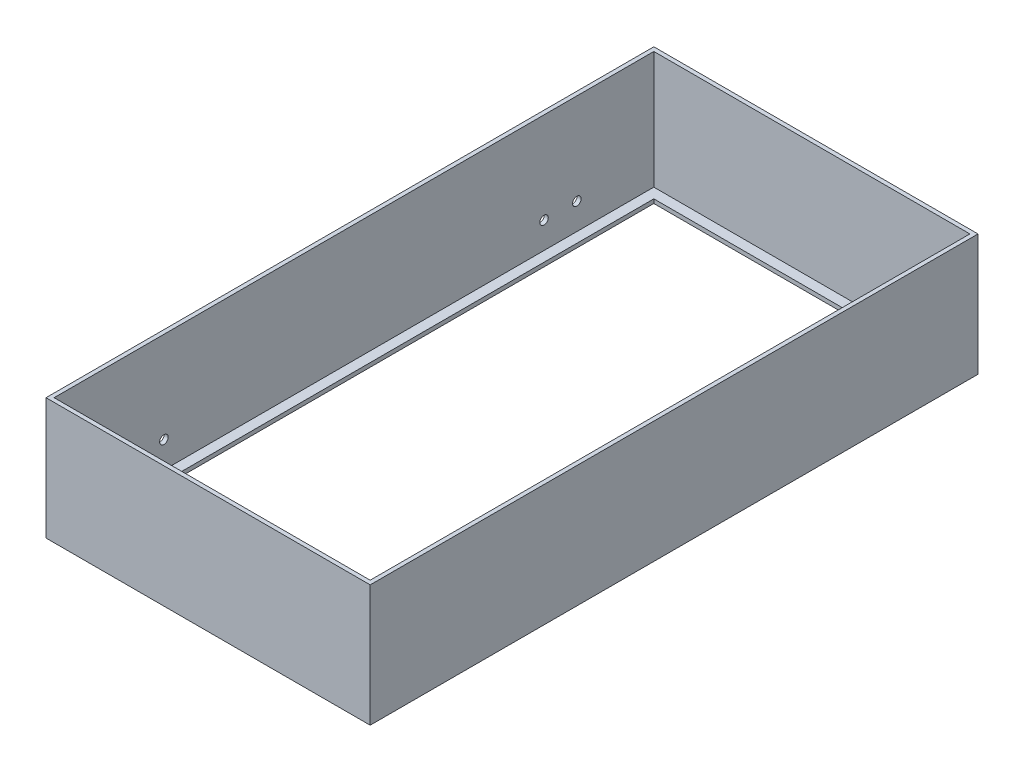
ISO-10303-21;
HEADER;
FILE_DESCRIPTION(('STEP AP214'),'2;1');
FILE_NAME('part.step','',(''),(''),'','','');
FILE_SCHEMA(('AUTOMOTIVE_DESIGN { 1 0 10303 214 1 1 1 1 }'));
ENDSEC;
DATA;
#1=APPLICATION_CONTEXT('core data for automotive mechanical design processes');
#2=APPLICATION_PROTOCOL_DEFINITION('international standard','automotive_design',2000,#1);
#3=PRODUCT_CONTEXT('',#1,'mechanical');
#4=PRODUCT('Part','Part','',(#3));
#5=PRODUCT_RELATED_PRODUCT_CATEGORY('part','',(#4));
#6=PRODUCT_DEFINITION_FORMATION('','',#4);
#7=PRODUCT_DEFINITION_CONTEXT('part definition',#1,'design');
#8=PRODUCT_DEFINITION('design','',#6,#7);
#9=PRODUCT_DEFINITION_SHAPE('','',#8);
#10=(LENGTH_UNIT() NAMED_UNIT(*) SI_UNIT(.MILLI.,.METRE.));
#11=(NAMED_UNIT(*) PLANE_ANGLE_UNIT() SI_UNIT($,.RADIAN.));
#12=(NAMED_UNIT(*) SI_UNIT($,.STERADIAN.) SOLID_ANGLE_UNIT());
#13=UNCERTAINTY_MEASURE_WITH_UNIT(LENGTH_MEASURE(1.E-05),#10,'distance_accuracy_value','');
#14=(GEOMETRIC_REPRESENTATION_CONTEXT(3) GLOBAL_UNCERTAINTY_ASSIGNED_CONTEXT((#13)) GLOBAL_UNIT_ASSIGNED_CONTEXT((#10,
#11,#12)) REPRESENTATION_CONTEXT('',''));
#15=CARTESIAN_POINT('',(0.,0.,0.));
#16=DIRECTION('',(0.,0.,1.));
#17=DIRECTION('',(1.,0.,0.));
#18=AXIS2_PLACEMENT_3D('',#15,#16,#17);
#19=CARTESIAN_POINT('',(203.2,76.2,381.));
#20=DIRECTION('',(0.,-1.,0.));
#21=DIRECTION('',(1.,0.,0.));
#22=AXIS2_PLACEMENT_3D('',#19,#20,#21);
#23=PLANE('',#22);
#24=DIRECTION('',(-1.,0.,0.));
#25=VECTOR('',#24,1.);
#26=CARTESIAN_POINT('',(200.66,76.2,2.54));
#27=LINE('',#26,#25);
#28=CARTESIAN_POINT('',(200.66,76.2,2.53999999999999));
#29=VERTEX_POINT('',#28);
#30=CARTESIAN_POINT('',(2.54,76.2,2.54));
#31=VERTEX_POINT('',#30);
#32=EDGE_CURVE('E180',#29,#31,#27,.T.);
#33=ORIENTED_EDGE('',*,*,#32,.F.);
#34=DIRECTION('',(0.,0.,-1.));
#35=VECTOR('',#34,1.);
#36=CARTESIAN_POINT('',(200.66,76.2,378.46));
#37=LINE('',#36,#35);
#38=CARTESIAN_POINT('',(200.66,76.2,378.46));
#39=VERTEX_POINT('',#38);
#40=EDGE_CURVE('E178',#39,#29,#37,.T.);
#41=ORIENTED_EDGE('',*,*,#40,.F.);
#42=DIRECTION('',(1.,0.,0.));
#43=VECTOR('',#42,1.);
#44=CARTESIAN_POINT('',(2.54,76.2,378.46));
#45=LINE('',#44,#43);
#46=CARTESIAN_POINT('',(2.54,76.2,378.46));
#47=VERTEX_POINT('',#46);
#48=EDGE_CURVE('E185',#47,#39,#45,.T.);
#49=ORIENTED_EDGE('',*,*,#48,.F.);
#50=DIRECTION('',(0.,0.,1.));
#51=VECTOR('',#50,1.);
#52=CARTESIAN_POINT('',(2.54,76.2,2.54));
#53=LINE('',#52,#51);
#54=EDGE_CURVE('E182',#31,#47,#53,.T.);
#55=ORIENTED_EDGE('',*,*,#54,.F.);
#56=EDGE_LOOP('',(#33,#41,#49,#55));
#57=FACE_BOUND('',#56,.T.);
#58=DIRECTION('',(-1.,0.,0.));
#59=VECTOR('',#58,1.);
#60=CARTESIAN_POINT('',(203.2,76.2,0.));
#61=LINE('',#60,#59);
#62=CARTESIAN_POINT('',(203.2,76.2,0.));
#63=VERTEX_POINT('',#62);
#64=CARTESIAN_POINT('',(0.,76.2,0.));
#65=VERTEX_POINT('',#64);
#66=EDGE_CURVE('E190',#63,#65,#61,.T.);
#67=ORIENTED_EDGE('',*,*,#66,.T.);
#68=DIRECTION('',(0.,0.,-1.));
#69=VECTOR('',#68,1.);
#70=CARTESIAN_POINT('',(0.,76.2,381.));
#71=LINE('',#70,#69);
#72=CARTESIAN_POINT('',(0.,76.2,381.));
#73=VERTEX_POINT('',#72);
#74=EDGE_CURVE('E11',#73,#65,#71,.T.);
#75=ORIENTED_EDGE('',*,*,#74,.F.);
#76=DIRECTION('',(-1.,0.,0.));
#77=VECTOR('',#76,1.);
#78=CARTESIAN_POINT('',(203.2,76.2,381.));
#79=LINE('',#78,#77);
#80=CARTESIAN_POINT('',(203.2,76.2,381.));
#81=VERTEX_POINT('',#80);
#82=EDGE_CURVE('E196',#81,#73,#79,.T.);
#83=ORIENTED_EDGE('',*,*,#82,.F.);
#84=DIRECTION('',(0.,0.,-1.));
#85=VECTOR('',#84,1.);
#86=CARTESIAN_POINT('',(203.2,76.2,381.));
#87=LINE('',#86,#85);
#88=EDGE_CURVE('E206',#81,#63,#87,.T.);
#89=ORIENTED_EDGE('',*,*,#88,.T.);
#90=EDGE_LOOP('',(#67,#75,#83,#89));
#91=FACE_BOUND('',#90,.T.);
#92=ADVANCED_FACE('F38',(#57,#91),#23,.F.);
#93=CARTESIAN_POINT('',(0.,76.2,381.));
#94=DIRECTION('',(1.,0.,0.));
#95=DIRECTION('',(0.,1.,0.));
#96=AXIS2_PLACEMENT_3D('',#93,#94,#95);
#97=PLANE('',#96);
#98=CARTESIAN_POINT('',(0.,19.05,71.374));
#99=DIRECTION('',(1.,0.,0.));
#100=DIRECTION('',(0.,-1.,0.));
#101=AXIS2_PLACEMENT_3D('',#98,#99,#100);
#102=CIRCLE('',#101,2.66699999999997);
#103=CARTESIAN_POINT('',(0.,16.383,71.374));
#104=VERTEX_POINT('',#103);
#105=EDGE_CURVE('E309',#104,#104,#102,.T.);
#106=ORIENTED_EDGE('',*,*,#105,.T.);
#107=EDGE_LOOP('',(#106));
#108=FACE_BOUND('',#107,.T.);
#109=CARTESIAN_POINT('',(0.,19.05,50.8));
#110=DIRECTION('',(1.,0.,0.));
#111=DIRECTION('',(0.,-1.,0.));
#112=AXIS2_PLACEMENT_3D('',#109,#110,#111);
#113=CIRCLE('',#112,2.66699999999997);
#114=CARTESIAN_POINT('',(0.,16.383,50.8));
#115=VERTEX_POINT('',#114);
#116=EDGE_CURVE('E315',#115,#115,#113,.T.);
#117=ORIENTED_EDGE('',*,*,#116,.T.);
#118=EDGE_LOOP('',(#117));
#119=FACE_BOUND('',#118,.T.);
#120=CARTESIAN_POINT('',(0.,19.05,309.626));
#121=DIRECTION('',(-1.,0.,0.));
#122=DIRECTION('',(0.,-1.,0.));
#123=AXIS2_PLACEMENT_3D('',#120,#121,#122);
#124=CIRCLE('',#123,2.66699999999997);
#125=CARTESIAN_POINT('',(0.,16.383,309.626));
#126=VERTEX_POINT('',#125);
#127=EDGE_CURVE('E322',#126,#126,#124,.T.);
#128=ORIENTED_EDGE('',*,*,#127,.F.);
#129=EDGE_LOOP('',(#128));
#130=FACE_BOUND('',#129,.T.);
#131=CARTESIAN_POINT('',(0.,19.05,330.2));
#132=DIRECTION('',(-1.,0.,0.));
#133=DIRECTION('',(0.,-1.,0.));
#134=AXIS2_PLACEMENT_3D('',#131,#132,#133);
#135=CIRCLE('',#134,2.66699999999997);
#136=CARTESIAN_POINT('',(0.,16.383,330.2));
#137=VERTEX_POINT('',#136);
#138=EDGE_CURVE('E312',#137,#137,#135,.T.);
#139=ORIENTED_EDGE('',*,*,#138,.F.);
#140=EDGE_LOOP('',(#139));
#141=FACE_BOUND('',#140,.T.);
#142=DIRECTION('',(0.,-1.,0.));
#143=VECTOR('',#142,1.);
#144=CARTESIAN_POINT('',(0.,76.2,0.));
#145=LINE('',#144,#143);
#146=CARTESIAN_POINT('',(0.,0.,0.));
#147=VERTEX_POINT('',#146);
#148=EDGE_CURVE('E209',#65,#147,#145,.T.);
#149=ORIENTED_EDGE('',*,*,#148,.T.);
#150=DIRECTION('',(0.,0.,-1.));
#151=VECTOR('',#150,1.);
#152=CARTESIAN_POINT('',(0.,0.,381.));
#153=LINE('',#152,#151);
#154=CARTESIAN_POINT('',(0.,0.,381.));
#155=VERTEX_POINT('',#154);
#156=EDGE_CURVE('E45',#155,#147,#153,.T.);
#157=ORIENTED_EDGE('',*,*,#156,.F.);
#158=DIRECTION('',(0.,-1.,0.));
#159=VECTOR('',#158,1.);
#160=CARTESIAN_POINT('',(0.,76.2,381.));
#161=LINE('',#160,#159);
#162=EDGE_CURVE('E199',#73,#155,#161,.T.);
#163=ORIENTED_EDGE('',*,*,#162,.F.);
#164=ORIENTED_EDGE('',*,*,#74,.T.);
#165=EDGE_LOOP('',(#149,#157,#163,#164));
#166=FACE_BOUND('',#165,.T.);
#167=ADVANCED_FACE('F240',(#108,#119,#130,#141,#166),#97,.F.);
#168=CARTESIAN_POINT('',(203.2,0.,381.));
#169=DIRECTION('',(0.,1.,0.));
#170=DIRECTION('',(0.,0.,1.));
#171=AXIS2_PLACEMENT_3D('',#168,#169,#170);
#172=PLANE('',#171);
#173=DIRECTION('',(1.,0.,0.));
#174=VECTOR('',#173,1.);
#175=CARTESIAN_POINT('',(203.2,0.,0.));
#176=LINE('',#175,#174);
#177=CARTESIAN_POINT('',(203.2,0.,0.));
#178=VERTEX_POINT('',#177);
#179=EDGE_CURVE('E211',#147,#178,#176,.T.);
#180=ORIENTED_EDGE('',*,*,#179,.T.);
#181=DIRECTION('',(0.,0.,-1.));
#182=VECTOR('',#181,1.);
#183=CARTESIAN_POINT('',(203.2,0.,381.));
#184=LINE('',#183,#182);
#185=CARTESIAN_POINT('',(203.2,0.,381.));
#186=VERTEX_POINT('',#185);
#187=EDGE_CURVE('E216',#186,#178,#184,.T.);
#188=ORIENTED_EDGE('',*,*,#187,.F.);
#189=DIRECTION('',(1.,0.,0.));
#190=VECTOR('',#189,1.);
#191=CARTESIAN_POINT('',(203.2,0.,381.));
#192=LINE('',#191,#190);
#193=EDGE_CURVE('E202',#155,#186,#192,.T.);
#194=ORIENTED_EDGE('',*,*,#193,.F.);
#195=ORIENTED_EDGE('',*,*,#156,.T.);
#196=EDGE_LOOP('',(#180,#188,#194,#195));
#197=FACE_BOUND('',#196,.T.);
#198=DIRECTION('',(0.,0.,1.));
#199=VECTOR('',#198,1.);
#200=CARTESIAN_POINT('',(8.89,0.,8.89));
#201=LINE('',#200,#199);
#202=CARTESIAN_POINT('',(8.89,0.,8.89));
#203=VERTEX_POINT('',#202);
#204=CARTESIAN_POINT('',(8.89,0.,372.11));
#205=VERTEX_POINT('',#204);
#206=EDGE_CURVE('E159',#203,#205,#201,.T.);
#207=ORIENTED_EDGE('',*,*,#206,.T.);
#208=DIRECTION('',(1.,0.,0.));
#209=VECTOR('',#208,1.);
#210=CARTESIAN_POINT('',(8.89,0.,372.11));
#211=LINE('',#210,#209);
#212=CARTESIAN_POINT('',(194.31,0.,372.11));
#213=VERTEX_POINT('',#212);
#214=EDGE_CURVE('E145',#205,#213,#211,.T.);
#215=ORIENTED_EDGE('',*,*,#214,.T.);
#216=DIRECTION('',(0.,0.,-1.));
#217=VECTOR('',#216,1.);
#218=CARTESIAN_POINT('',(194.31,0.,372.11));
#219=LINE('',#218,#217);
#220=CARTESIAN_POINT('',(194.31,0.,8.88999999999999));
#221=VERTEX_POINT('',#220);
#222=EDGE_CURVE('E163',#213,#221,#219,.T.);
#223=ORIENTED_EDGE('',*,*,#222,.T.);
#224=DIRECTION('',(-1.,0.,0.));
#225=VECTOR('',#224,1.);
#226=CARTESIAN_POINT('',(194.31,0.,8.88999999999999));
#227=LINE('',#226,#225);
#228=EDGE_CURVE('E139',#221,#203,#227,.T.);
#229=ORIENTED_EDGE('',*,*,#228,.T.);
#230=EDGE_LOOP('',(#207,#215,#223,#229));
#231=FACE_BOUND('',#230,.T.);
#232=ADVANCED_FACE('F223',(#197,#231),#172,.F.);
#233=CARTESIAN_POINT('',(203.2,0.,381.));
#234=DIRECTION('',(-1.,0.,0.));
#235=DIRECTION('',(0.,0.,1.));
#236=AXIS2_PLACEMENT_3D('',#233,#234,#235);
#237=PLANE('',#236);
#238=DIRECTION('',(0.,1.,0.));
#239=VECTOR('',#238,1.);
#240=CARTESIAN_POINT('',(203.2,0.,0.));
#241=LINE('',#240,#239);
#242=EDGE_CURVE('E200',#178,#63,#241,.T.);
#243=ORIENTED_EDGE('',*,*,#242,.T.);
#244=ORIENTED_EDGE('',*,*,#88,.F.);
#245=DIRECTION('',(0.,1.,0.));
#246=VECTOR('',#245,1.);
#247=CARTESIAN_POINT('',(203.2,0.,381.));
#248=LINE('',#247,#246);
#249=EDGE_CURVE('E204',#186,#81,#248,.T.);
#250=ORIENTED_EDGE('',*,*,#249,.F.);
#251=ORIENTED_EDGE('',*,*,#187,.T.);
#252=EDGE_LOOP('',(#243,#244,#250,#251));
#253=FACE_BOUND('',#252,.T.);
#254=ADVANCED_FACE('F233',(#253),#237,.F.);
#255=CARTESIAN_POINT('',(0.,0.,381.));
#256=DIRECTION('',(0.,0.,1.));
#257=DIRECTION('',(1.,0.,0.));
#258=AXIS2_PLACEMENT_3D('',#255,#256,#257);
#259=PLANE('',#258);
#260=ORIENTED_EDGE('',*,*,#82,.T.);
#261=ORIENTED_EDGE('',*,*,#162,.T.);
#262=ORIENTED_EDGE('',*,*,#193,.T.);
#263=ORIENTED_EDGE('',*,*,#249,.T.);
#264=EDGE_LOOP('',(#260,#261,#262,#263));
#265=FACE_BOUND('',#264,.T.);
#266=ADVANCED_FACE('F239',(#265),#259,.T.);
#267=CARTESIAN_POINT('',(0.,0.,0.));
#268=DIRECTION('',(0.,0.,1.));
#269=DIRECTION('',(1.,0.,0.));
#270=AXIS2_PLACEMENT_3D('',#267,#268,#269);
#271=PLANE('',#270);
#272=ORIENTED_EDGE('',*,*,#66,.F.);
#273=ORIENTED_EDGE('',*,*,#242,.F.);
#274=ORIENTED_EDGE('',*,*,#179,.F.);
#275=ORIENTED_EDGE('',*,*,#148,.F.);
#276=EDGE_LOOP('',(#272,#273,#274,#275));
#277=FACE_BOUND('',#276,.T.);
#278=ADVANCED_FACE('F230',(#277),#271,.F.);
#279=CARTESIAN_POINT('',(200.66,0.,378.46));
#280=DIRECTION('',(1.,0.,0.));
#281=DIRECTION('',(0.,1.,0.));
#282=AXIS2_PLACEMENT_3D('',#279,#280,#281);
#283=PLANE('',#282);
#284=DIRECTION('',(0.,1.,0.));
#285=VECTOR('',#284,1.);
#286=CARTESIAN_POINT('',(200.66,0.,2.54));
#287=LINE('',#286,#285);
#288=CARTESIAN_POINT('',(200.66,2.54,2.54));
#289=VERTEX_POINT('',#288);
#290=EDGE_CURVE('E59',#289,#29,#287,.T.);
#291=ORIENTED_EDGE('',*,*,#290,.F.);
#292=DIRECTION('',(0.,0.,-1.));
#293=VECTOR('',#292,1.);
#294=CARTESIAN_POINT('',(200.66,2.54,2.54));
#295=LINE('',#294,#293);
#296=CARTESIAN_POINT('',(200.66,2.54,378.46));
#297=VERTEX_POINT('',#296);
#298=EDGE_CURVE('E52',#297,#289,#295,.T.);
#299=ORIENTED_EDGE('',*,*,#298,.F.);
#300=DIRECTION('',(0.,1.,0.));
#301=VECTOR('',#300,1.);
#302=CARTESIAN_POINT('',(200.66,0.,378.46));
#303=LINE('',#302,#301);
#304=EDGE_CURVE('E188',#297,#39,#303,.T.);
#305=ORIENTED_EDGE('',*,*,#304,.T.);
#306=ORIENTED_EDGE('',*,*,#40,.T.);
#307=EDGE_LOOP('',(#291,#299,#305,#306));
#308=FACE_BOUND('',#307,.T.);
#309=ADVANCED_FACE('F256',(#308),#283,.F.);
#310=CARTESIAN_POINT('',(2.54000000000001,0.,378.46));
#311=DIRECTION('',(0.,0.,1.));
#312=DIRECTION('',(1.,0.,0.));
#313=AXIS2_PLACEMENT_3D('',#310,#311,#312);
#314=PLANE('',#313);
#315=ORIENTED_EDGE('',*,*,#304,.F.);
#316=DIRECTION('',(1.,0.,0.));
#317=VECTOR('',#316,1.);
#318=CARTESIAN_POINT('',(2.54000000000005,2.54,378.46));
#319=LINE('',#318,#317);
#320=CARTESIAN_POINT('',(2.54000000000005,2.54,378.46));
#321=VERTEX_POINT('',#320);
#322=EDGE_CURVE('E173',#321,#297,#319,.T.);
#323=ORIENTED_EDGE('',*,*,#322,.F.);
#324=DIRECTION('',(0.,1.,0.));
#325=VECTOR('',#324,1.);
#326=CARTESIAN_POINT('',(2.54000000000001,0.,378.46));
#327=LINE('',#326,#325);
#328=EDGE_CURVE('E191',#321,#47,#327,.T.);
#329=ORIENTED_EDGE('',*,*,#328,.T.);
#330=ORIENTED_EDGE('',*,*,#48,.T.);
#331=EDGE_LOOP('',(#315,#323,#329,#330));
#332=FACE_BOUND('',#331,.T.);
#333=ADVANCED_FACE('F261',(#332),#314,.F.);
#334=CARTESIAN_POINT('',(2.54000000000001,0.,2.54));
#335=DIRECTION('',(-1.,0.,0.));
#336=DIRECTION('',(0.,-1.,0.));
#337=AXIS2_PLACEMENT_3D('',#334,#335,#336);
#338=PLANE('',#337);
#339=CARTESIAN_POINT('',(2.54,19.05,71.374));
#340=DIRECTION('',(1.,0.,0.));
#341=DIRECTION('',(0.,-1.,0.));
#342=AXIS2_PLACEMENT_3D('',#339,#340,#341);
#343=CIRCLE('',#342,2.66699999999997);
#344=CARTESIAN_POINT('',(2.54,16.383,71.374));
#345=VERTEX_POINT('',#344);
#346=EDGE_CURVE('E307',#345,#345,#343,.T.);
#347=ORIENTED_EDGE('',*,*,#346,.F.);
#348=EDGE_LOOP('',(#347));
#349=FACE_BOUND('',#348,.T.);
#350=CARTESIAN_POINT('',(2.54,19.05,50.8));
#351=DIRECTION('',(1.,0.,0.));
#352=DIRECTION('',(0.,-1.,0.));
#353=AXIS2_PLACEMENT_3D('',#350,#351,#352);
#354=CIRCLE('',#353,2.66699999999997);
#355=CARTESIAN_POINT('',(2.54,16.383,50.8));
#356=VERTEX_POINT('',#355);
#357=EDGE_CURVE('E310',#356,#356,#354,.T.);
#358=ORIENTED_EDGE('',*,*,#357,.F.);
#359=EDGE_LOOP('',(#358));
#360=FACE_BOUND('',#359,.T.);
#361=CARTESIAN_POINT('',(2.54,19.05,309.626));
#362=DIRECTION('',(-1.,0.,0.));
#363=DIRECTION('',(0.,-1.,0.));
#364=AXIS2_PLACEMENT_3D('',#361,#362,#363);
#365=CIRCLE('',#364,2.66699999999997);
#366=CARTESIAN_POINT('',(2.54,16.383,309.626));
#367=VERTEX_POINT('',#366);
#368=EDGE_CURVE('E161',#367,#367,#365,.T.);
#369=ORIENTED_EDGE('',*,*,#368,.T.);
#370=EDGE_LOOP('',(#369));
#371=FACE_BOUND('',#370,.T.);
#372=CARTESIAN_POINT('',(2.54,19.05,330.2));
#373=DIRECTION('',(-1.,0.,0.));
#374=DIRECTION('',(0.,-1.,0.));
#375=AXIS2_PLACEMENT_3D('',#372,#373,#374);
#376=CIRCLE('',#375,2.66699999999997);
#377=CARTESIAN_POINT('',(2.54,16.383,330.2));
#378=VERTEX_POINT('',#377);
#379=EDGE_CURVE('E325',#378,#378,#376,.T.);
#380=ORIENTED_EDGE('',*,*,#379,.T.);
#381=EDGE_LOOP('',(#380));
#382=FACE_BOUND('',#381,.T.);
#383=ORIENTED_EDGE('',*,*,#328,.F.);
#384=DIRECTION('',(0.,0.,1.));
#385=VECTOR('',#384,1.);
#386=CARTESIAN_POINT('',(2.54000000000001,2.54,2.54));
#387=LINE('',#386,#385);
#388=CARTESIAN_POINT('',(2.54000000000001,2.54,2.54));
#389=VERTEX_POINT('',#388);
#390=EDGE_CURVE('E146',#389,#321,#387,.T.);
#391=ORIENTED_EDGE('',*,*,#390,.F.);
#392=DIRECTION('',(0.,1.,0.));
#393=VECTOR('',#392,1.);
#394=CARTESIAN_POINT('',(2.54000000000001,0.,2.54));
#395=LINE('',#394,#393);
#396=EDGE_CURVE('E193',#389,#31,#395,.T.);
#397=ORIENTED_EDGE('',*,*,#396,.T.);
#398=ORIENTED_EDGE('',*,*,#54,.T.);
#399=EDGE_LOOP('',(#383,#391,#397,#398));
#400=FACE_BOUND('',#399,.T.);
#401=ADVANCED_FACE('F266',(#349,#360,#371,#382,#400),#338,.F.);
#402=CARTESIAN_POINT('',(200.66,0.,2.54));
#403=DIRECTION('',(0.,0.,-1.));
#404=DIRECTION('',(-1.,0.,0.));
#405=AXIS2_PLACEMENT_3D('',#402,#403,#404);
#406=PLANE('',#405);
#407=ORIENTED_EDGE('',*,*,#396,.F.);
#408=DIRECTION('',(-1.,0.,0.));
#409=VECTOR('',#408,1.);
#410=CARTESIAN_POINT('',(2.54000000000001,2.54,2.54));
#411=LINE('',#410,#409);
#412=EDGE_CURVE('E176',#289,#389,#411,.T.);
#413=ORIENTED_EDGE('',*,*,#412,.F.);
#414=ORIENTED_EDGE('',*,*,#290,.T.);
#415=ORIENTED_EDGE('',*,*,#32,.T.);
#416=EDGE_LOOP('',(#407,#413,#414,#415));
#417=FACE_BOUND('',#416,.T.);
#418=ADVANCED_FACE('F263',(#417),#406,.F.);
#419=CARTESIAN_POINT('',(0.,2.54,0.));
#420=DIRECTION('',(0.,1.,0.));
#421=DIRECTION('',(0.,0.,1.));
#422=AXIS2_PLACEMENT_3D('',#419,#420,#421);
#423=PLANE('',#422);
#424=ORIENTED_EDGE('',*,*,#390,.T.);
#425=ORIENTED_EDGE('',*,*,#322,.T.);
#426=ORIENTED_EDGE('',*,*,#298,.T.);
#427=ORIENTED_EDGE('',*,*,#412,.T.);
#428=EDGE_LOOP('',(#424,#425,#426,#427));
#429=FACE_BOUND('',#428,.T.);
#430=DIRECTION('',(1.,0.,0.));
#431=VECTOR('',#430,1.);
#432=CARTESIAN_POINT('',(8.89,2.54,372.11));
#433=LINE('',#432,#431);
#434=CARTESIAN_POINT('',(8.89,2.54,372.11));
#435=VERTEX_POINT('',#434);
#436=CARTESIAN_POINT('',(194.31,2.54,372.11));
#437=VERTEX_POINT('',#436);
#438=EDGE_CURVE('E138',#435,#437,#433,.T.);
#439=ORIENTED_EDGE('',*,*,#438,.F.);
#440=DIRECTION('',(0.,0.,1.));
#441=VECTOR('',#440,1.);
#442=CARTESIAN_POINT('',(8.89,2.54,8.89));
#443=LINE('',#442,#441);
#444=CARTESIAN_POINT('',(8.89,2.54,8.89));
#445=VERTEX_POINT('',#444);
#446=EDGE_CURVE('E128',#445,#435,#443,.T.);
#447=ORIENTED_EDGE('',*,*,#446,.F.);
#448=DIRECTION('',(-1.,0.,0.));
#449=VECTOR('',#448,1.);
#450=CARTESIAN_POINT('',(194.31,2.54,8.88999999999999));
#451=LINE('',#450,#449);
#452=CARTESIAN_POINT('',(194.31,2.54,8.88999999999999));
#453=VERTEX_POINT('',#452);
#454=EDGE_CURVE('E154',#453,#445,#451,.T.);
#455=ORIENTED_EDGE('',*,*,#454,.F.);
#456=DIRECTION('',(0.,0.,-1.));
#457=VECTOR('',#456,1.);
#458=CARTESIAN_POINT('',(194.31,2.54,372.11));
#459=LINE('',#458,#457);
#460=EDGE_CURVE('E152',#437,#453,#459,.T.);
#461=ORIENTED_EDGE('',*,*,#460,.F.);
#462=EDGE_LOOP('',(#439,#447,#455,#461));
#463=FACE_BOUND('',#462,.T.);
#464=ADVANCED_FACE('F150',(#429,#463),#423,.T.);
#465=CARTESIAN_POINT('',(8.89,2.54,8.89));
#466=DIRECTION('',(1.,0.,0.));
#467=DIRECTION('',(0.,0.,-1.));
#468=AXIS2_PLACEMENT_3D('',#465,#466,#467);
#469=PLANE('',#468);
#470=ORIENTED_EDGE('',*,*,#206,.F.);
#471=DIRECTION('',(0.,-1.,0.));
#472=VECTOR('',#471,1.);
#473=CARTESIAN_POINT('',(8.89,2.54,8.89));
#474=LINE('',#473,#472);
#475=EDGE_CURVE('E134',#445,#203,#474,.T.);
#476=ORIENTED_EDGE('',*,*,#475,.F.);
#477=ORIENTED_EDGE('',*,*,#446,.T.);
#478=DIRECTION('',(0.,-1.,0.));
#479=VECTOR('',#478,1.);
#480=CARTESIAN_POINT('',(8.89,2.54,372.11));
#481=LINE('',#480,#479);
#482=EDGE_CURVE('E131',#435,#205,#481,.T.);
#483=ORIENTED_EDGE('',*,*,#482,.T.);
#484=EDGE_LOOP('',(#470,#476,#477,#483));
#485=FACE_BOUND('',#484,.T.);
#486=ADVANCED_FACE('F130',(#485),#469,.T.);
#487=CARTESIAN_POINT('',(8.89,2.54,372.11));
#488=DIRECTION('',(0.,0.,-1.));
#489=DIRECTION('',(-1.,0.,0.));
#490=AXIS2_PLACEMENT_3D('',#487,#488,#489);
#491=PLANE('',#490);
#492=ORIENTED_EDGE('',*,*,#214,.F.);
#493=ORIENTED_EDGE('',*,*,#482,.F.);
#494=ORIENTED_EDGE('',*,*,#438,.T.);
#495=DIRECTION('',(0.,-1.,0.));
#496=VECTOR('',#495,1.);
#497=CARTESIAN_POINT('',(194.31,2.54,372.11));
#498=LINE('',#497,#496);
#499=EDGE_CURVE('E147',#437,#213,#498,.T.);
#500=ORIENTED_EDGE('',*,*,#499,.T.);
#501=EDGE_LOOP('',(#492,#493,#494,#500));
#502=FACE_BOUND('',#501,.T.);
#503=ADVANCED_FACE('F142',(#502),#491,.T.);
#504=CARTESIAN_POINT('',(194.31,2.54,372.11));
#505=DIRECTION('',(-1.,0.,0.));
#506=DIRECTION('',(0.,0.,1.));
#507=AXIS2_PLACEMENT_3D('',#504,#505,#506);
#508=PLANE('',#507);
#509=ORIENTED_EDGE('',*,*,#222,.F.);
#510=ORIENTED_EDGE('',*,*,#499,.F.);
#511=ORIENTED_EDGE('',*,*,#460,.T.);
#512=DIRECTION('',(0.,-1.,0.));
#513=VECTOR('',#512,1.);
#514=CARTESIAN_POINT('',(194.31,2.54,8.88999999999999));
#515=LINE('',#514,#513);
#516=EDGE_CURVE('E169',#453,#221,#515,.T.);
#517=ORIENTED_EDGE('',*,*,#516,.T.);
#518=EDGE_LOOP('',(#509,#510,#511,#517));
#519=FACE_BOUND('',#518,.T.);
#520=ADVANCED_FACE('F279',(#519),#508,.T.);
#521=CARTESIAN_POINT('',(194.31,2.54,8.88999999999999));
#522=DIRECTION('',(0.,0.,1.));
#523=DIRECTION('',(1.,0.,0.));
#524=AXIS2_PLACEMENT_3D('',#521,#522,#523);
#525=PLANE('',#524);
#526=ORIENTED_EDGE('',*,*,#228,.F.);
#527=ORIENTED_EDGE('',*,*,#516,.F.);
#528=ORIENTED_EDGE('',*,*,#454,.T.);
#529=ORIENTED_EDGE('',*,*,#475,.T.);
#530=EDGE_LOOP('',(#526,#527,#528,#529));
#531=FACE_BOUND('',#530,.T.);
#532=ADVANCED_FACE('F282',(#531),#525,.T.);
#533=CARTESIAN_POINT('',(2.54,19.05,330.2));
#534=DIRECTION('',(-1.,0.,0.));
#535=DIRECTION('',(0.,-1.,0.));
#536=AXIS2_PLACEMENT_3D('',#533,#534,#535);
#537=CYLINDRICAL_SURFACE('',#536,2.66699999999997);
#538=ORIENTED_EDGE('',*,*,#379,.F.);
#539=EDGE_LOOP('',(#538));
#540=FACE_BOUND('',#539,.T.);
#541=ORIENTED_EDGE('',*,*,#138,.T.);
#542=EDGE_LOOP('',(#541));
#543=FACE_BOUND('',#542,.T.);
#544=ADVANCED_FACE('F286',(#540,#543),#537,.F.);
#545=CARTESIAN_POINT('',(2.54,19.05,309.626));
#546=DIRECTION('',(-1.,0.,0.));
#547=DIRECTION('',(0.,-1.,0.));
#548=AXIS2_PLACEMENT_3D('',#545,#546,#547);
#549=CYLINDRICAL_SURFACE('',#548,2.66699999999997);
#550=ORIENTED_EDGE('',*,*,#368,.F.);
#551=EDGE_LOOP('',(#550));
#552=FACE_BOUND('',#551,.T.);
#553=ORIENTED_EDGE('',*,*,#127,.T.);
#554=EDGE_LOOP('',(#553));
#555=FACE_BOUND('',#554,.T.);
#556=ADVANCED_FACE('F290',(#552,#555),#549,.F.);
#557=CARTESIAN_POINT('',(2.54,19.05,50.8));
#558=DIRECTION('',(-1.,0.,0.));
#559=DIRECTION('',(0.,-1.,0.));
#560=AXIS2_PLACEMENT_3D('',#557,#558,#559);
#561=CYLINDRICAL_SURFACE('',#560,2.66699999999997);
#562=ORIENTED_EDGE('',*,*,#357,.T.);
#563=EDGE_LOOP('',(#562));
#564=FACE_BOUND('',#563,.T.);
#565=ORIENTED_EDGE('',*,*,#116,.F.);
#566=EDGE_LOOP('',(#565));
#567=FACE_BOUND('',#566,.T.);
#568=ADVANCED_FACE('F294',(#564,#567),#561,.F.);
#569=CARTESIAN_POINT('',(2.54,19.05,71.374));
#570=DIRECTION('',(-1.,0.,0.));
#571=DIRECTION('',(0.,-1.,0.));
#572=AXIS2_PLACEMENT_3D('',#569,#570,#571);
#573=CYLINDRICAL_SURFACE('',#572,2.66699999999997);
#574=ORIENTED_EDGE('',*,*,#346,.T.);
#575=EDGE_LOOP('',(#574));
#576=FACE_BOUND('',#575,.T.);
#577=ORIENTED_EDGE('',*,*,#105,.F.);
#578=EDGE_LOOP('',(#577));
#579=FACE_BOUND('',#578,.T.);
#580=ADVANCED_FACE('F298',(#576,#579),#573,.F.);
#581=CLOSED_SHELL('',(#92,#167,#232,#254,#266,#278,#309,#333,#401,#418,#464,#486,#503,#520,#532,
#544,#556,#568,#580));
#582=MANIFOLD_SOLID_BREP('B2',#581);
#583=ADVANCED_BREP_SHAPE_REPRESENTATION('',(#18,#582),#14);
#584=SHAPE_DEFINITION_REPRESENTATION(#9,#583);
ENDSEC;
END-ISO-10303-21;
